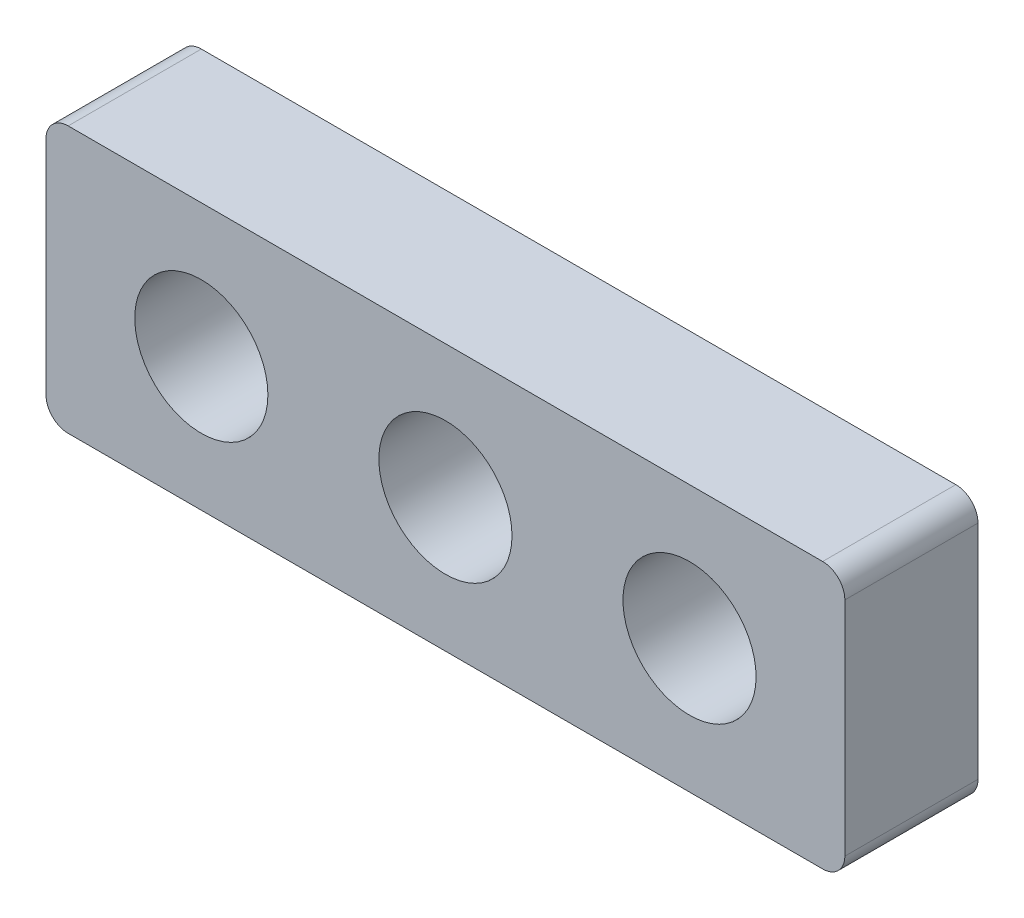
ISO-10303-21;
HEADER;
FILE_DESCRIPTION(('STEP AP214'),'2;1');
FILE_NAME('part.step','',(''),(''),'','','');
FILE_SCHEMA(('AUTOMOTIVE_DESIGN { 1 0 10303 214 1 1 1 1 }'));
ENDSEC;
DATA;
#1=APPLICATION_CONTEXT('core data for automotive mechanical design processes');
#2=APPLICATION_PROTOCOL_DEFINITION('international standard','automotive_design',2000,#1);
#3=PRODUCT_CONTEXT('',#1,'mechanical');
#4=PRODUCT('Part','Part','',(#3));
#5=PRODUCT_RELATED_PRODUCT_CATEGORY('part','',(#4));
#6=PRODUCT_DEFINITION_FORMATION('','',#4);
#7=PRODUCT_DEFINITION_CONTEXT('part definition',#1,'design');
#8=PRODUCT_DEFINITION('design','',#6,#7);
#9=PRODUCT_DEFINITION_SHAPE('','',#8);
#10=(LENGTH_UNIT() NAMED_UNIT(*) SI_UNIT(.MILLI.,.METRE.));
#11=(NAMED_UNIT(*) PLANE_ANGLE_UNIT() SI_UNIT($,.RADIAN.));
#12=(NAMED_UNIT(*) SI_UNIT($,.STERADIAN.) SOLID_ANGLE_UNIT());
#13=UNCERTAINTY_MEASURE_WITH_UNIT(LENGTH_MEASURE(1.E-05),#10,'distance_accuracy_value','');
#14=(GEOMETRIC_REPRESENTATION_CONTEXT(3) GLOBAL_UNCERTAINTY_ASSIGNED_CONTEXT((#13)) GLOBAL_UNIT_ASSIGNED_CONTEXT((#10,
#11,#12)) REPRESENTATION_CONTEXT('',''));
#15=CARTESIAN_POINT('',(0.,0.,0.));
#16=DIRECTION('',(0.,0.,1.));
#17=DIRECTION('',(1.,0.,0.));
#18=AXIS2_PLACEMENT_3D('',#15,#16,#17);
#19=CARTESIAN_POINT('',(0.,0.,1.5));
#20=DIRECTION('',(0.,0.,1.));
#21=DIRECTION('',(1.,0.,0.));
#22=AXIS2_PLACEMENT_3D('',#19,#20,#21);
#23=PLANE('',#22);
#24=CARTESIAN_POINT('',(5.5,0.,1.5));
#25=DIRECTION('',(0.,0.,1.));
#26=DIRECTION('',(1.,0.,0.));
#27=AXIS2_PLACEMENT_3D('',#24,#25,#26);
#28=CIRCLE('',#27,1.5);
#29=CARTESIAN_POINT('',(7.,0.,1.5));
#30=VERTEX_POINT('',#29);
#31=EDGE_CURVE('E192',#30,#30,#28,.T.);
#32=ORIENTED_EDGE('',*,*,#31,.F.);
#33=EDGE_LOOP('',(#32));
#34=FACE_BOUND('',#33,.T.);
#35=CARTESIAN_POINT('',(-5.5,0.,1.5));
#36=DIRECTION('',(0.,0.,1.));
#37=DIRECTION('',(1.,0.,0.));
#38=AXIS2_PLACEMENT_3D('',#35,#36,#37);
#39=CIRCLE('',#38,1.5);
#40=CARTESIAN_POINT('',(-4.,0.,1.5));
#41=VERTEX_POINT('',#40);
#42=EDGE_CURVE('E186',#41,#41,#39,.T.);
#43=ORIENTED_EDGE('',*,*,#42,.F.);
#44=EDGE_LOOP('',(#43));
#45=FACE_BOUND('',#44,.T.);
#46=DIRECTION('',(0.,1.,0.));
#47=VECTOR('',#46,1.);
#48=CARTESIAN_POINT('',(9.,-3.,1.5));
#49=LINE('',#48,#47);
#50=CARTESIAN_POINT('',(9.,-2.5,1.5));
#51=VERTEX_POINT('',#50);
#52=CARTESIAN_POINT('',(9.,2.5,1.5));
#53=VERTEX_POINT('',#52);
#54=EDGE_CURVE('E179',#51,#53,#49,.T.);
#55=ORIENTED_EDGE('',*,*,#54,.T.);
#56=CARTESIAN_POINT('',(8.5,2.5,1.5));
#57=DIRECTION('',(0.,0.,1.));
#58=DIRECTION('',(1.,0.,0.));
#59=AXIS2_PLACEMENT_3D('',#56,#57,#58);
#60=CIRCLE('',#59,0.5);
#61=CARTESIAN_POINT('',(8.5,3.,1.5));
#62=VERTEX_POINT('',#61);
#63=EDGE_CURVE('E156',#53,#62,#60,.T.);
#64=ORIENTED_EDGE('',*,*,#63,.T.);
#65=DIRECTION('',(-1.,0.,0.));
#66=VECTOR('',#65,1.);
#67=CARTESIAN_POINT('',(9.,3.,1.5));
#68=LINE('',#67,#66);
#69=CARTESIAN_POINT('',(-8.5,3.,1.5));
#70=VERTEX_POINT('',#69);
#71=EDGE_CURVE('E124',#62,#70,#68,.T.);
#72=ORIENTED_EDGE('',*,*,#71,.T.);
#73=CARTESIAN_POINT('',(-8.5,2.5,1.5));
#74=DIRECTION('',(0.,0.,1.));
#75=DIRECTION('',(1.,0.,0.));
#76=AXIS2_PLACEMENT_3D('',#73,#74,#75);
#77=CIRCLE('',#76,0.5);
#78=CARTESIAN_POINT('',(-9.,2.5,1.5));
#79=VERTEX_POINT('',#78);
#80=EDGE_CURVE('E151',#70,#79,#77,.T.);
#81=ORIENTED_EDGE('',*,*,#80,.T.);
#82=DIRECTION('',(0.,-1.,0.));
#83=VECTOR('',#82,1.);
#84=CARTESIAN_POINT('',(-9.,-3.,1.5));
#85=LINE('',#84,#83);
#86=CARTESIAN_POINT('',(-9.,-2.5,1.5));
#87=VERTEX_POINT('',#86);
#88=EDGE_CURVE('E132',#79,#87,#85,.T.);
#89=ORIENTED_EDGE('',*,*,#88,.T.);
#90=CARTESIAN_POINT('',(-8.5,-2.5,1.5));
#91=DIRECTION('',(0.,0.,1.));
#92=DIRECTION('',(1.,0.,0.));
#93=AXIS2_PLACEMENT_3D('',#90,#91,#92);
#94=CIRCLE('',#93,0.5);
#95=CARTESIAN_POINT('',(-8.5,-3.,1.5));
#96=VERTEX_POINT('',#95);
#97=EDGE_CURVE('E60',#87,#96,#94,.T.);
#98=ORIENTED_EDGE('',*,*,#97,.T.);
#99=DIRECTION('',(1.,0.,0.));
#100=VECTOR('',#99,1.);
#101=CARTESIAN_POINT('',(9.,-3.,1.5));
#102=LINE('',#101,#100);
#103=CARTESIAN_POINT('',(8.5,-3.,1.5));
#104=VERTEX_POINT('',#103);
#105=EDGE_CURVE('E137',#96,#104,#102,.T.);
#106=ORIENTED_EDGE('',*,*,#105,.T.);
#107=CARTESIAN_POINT('',(8.5,-2.5,1.5));
#108=DIRECTION('',(0.,0.,1.));
#109=DIRECTION('',(1.,0.,0.));
#110=AXIS2_PLACEMENT_3D('',#107,#108,#109);
#111=CIRCLE('',#110,0.5);
#112=EDGE_CURVE('E154',#104,#51,#111,.T.);
#113=ORIENTED_EDGE('',*,*,#112,.T.);
#114=EDGE_LOOP('',(#55,#64,#72,#81,#89,#98,#106,#113));
#115=FACE_BOUND('',#114,.T.);
#116=CARTESIAN_POINT('',(0.,0.,1.5));
#117=DIRECTION('',(0.,0.,1.));
#118=DIRECTION('',(1.,0.,0.));
#119=AXIS2_PLACEMENT_3D('',#116,#117,#118);
#120=CIRCLE('',#119,1.5);
#121=CARTESIAN_POINT('',(1.5,0.,1.5));
#122=VERTEX_POINT('',#121);
#123=EDGE_CURVE('E172',#122,#122,#120,.T.);
#124=ORIENTED_EDGE('',*,*,#123,.F.);
#125=EDGE_LOOP('',(#124));
#126=FACE_BOUND('',#125,.T.);
#127=ADVANCED_FACE('F38',(#34,#45,#115,#126),#23,.T.);
#128=CARTESIAN_POINT('',(0.,0.,-1.5));
#129=DIRECTION('',(0.,0.,1.));
#130=DIRECTION('',(1.,0.,0.));
#131=AXIS2_PLACEMENT_3D('',#128,#129,#130);
#132=PLANE('',#131);
#133=CARTESIAN_POINT('',(5.5,0.,-1.5));
#134=DIRECTION('',(0.,0.,1.));
#135=DIRECTION('',(1.,0.,0.));
#136=AXIS2_PLACEMENT_3D('',#133,#134,#135);
#137=CIRCLE('',#136,1.5);
#138=CARTESIAN_POINT('',(7.,0.,-1.5));
#139=VERTEX_POINT('',#138);
#140=EDGE_CURVE('E189',#139,#139,#137,.T.);
#141=ORIENTED_EDGE('',*,*,#140,.T.);
#142=EDGE_LOOP('',(#141));
#143=FACE_BOUND('',#142,.T.);
#144=CARTESIAN_POINT('',(-5.5,0.,-1.5));
#145=DIRECTION('',(0.,0.,1.));
#146=DIRECTION('',(1.,0.,0.));
#147=AXIS2_PLACEMENT_3D('',#144,#145,#146);
#148=CIRCLE('',#147,1.5);
#149=CARTESIAN_POINT('',(-4.,0.,-1.5));
#150=VERTEX_POINT('',#149);
#151=EDGE_CURVE('E184',#150,#150,#148,.T.);
#152=ORIENTED_EDGE('',*,*,#151,.T.);
#153=EDGE_LOOP('',(#152));
#154=FACE_BOUND('',#153,.T.);
#155=DIRECTION('',(-1.,0.,0.));
#156=VECTOR('',#155,1.);
#157=CARTESIAN_POINT('',(9.,3.,-1.5));
#158=LINE('',#157,#156);
#159=CARTESIAN_POINT('',(8.5,3.,-1.5));
#160=VERTEX_POINT('',#159);
#161=CARTESIAN_POINT('',(-8.5,3.,-1.5));
#162=VERTEX_POINT('',#161);
#163=EDGE_CURVE('E121',#160,#162,#158,.T.);
#164=ORIENTED_EDGE('',*,*,#163,.F.);
#165=CARTESIAN_POINT('',(8.5,2.5,-1.5));
#166=DIRECTION('',(0.,0.,1.));
#167=DIRECTION('',(1.,0.,0.));
#168=AXIS2_PLACEMENT_3D('',#165,#166,#167);
#169=CIRCLE('',#168,0.5);
#170=CARTESIAN_POINT('',(9.,2.5,-1.5));
#171=VERTEX_POINT('',#170);
#172=EDGE_CURVE('E104',#160,#171,#169,.F.);
#173=ORIENTED_EDGE('',*,*,#172,.T.);
#174=DIRECTION('',(0.,1.,0.));
#175=VECTOR('',#174,1.);
#176=CARTESIAN_POINT('',(9.,-3.,-1.5));
#177=LINE('',#176,#175);
#178=CARTESIAN_POINT('',(9.,-2.5,-1.5));
#179=VERTEX_POINT('',#178);
#180=EDGE_CURVE('E133',#179,#171,#177,.T.);
#181=ORIENTED_EDGE('',*,*,#180,.F.);
#182=CARTESIAN_POINT('',(8.5,-2.5,-1.5));
#183=DIRECTION('',(0.,0.,1.));
#184=DIRECTION('',(1.,0.,0.));
#185=AXIS2_PLACEMENT_3D('',#182,#183,#184);
#186=CIRCLE('',#185,0.5);
#187=CARTESIAN_POINT('',(8.5,-3.,-1.5));
#188=VERTEX_POINT('',#187);
#189=EDGE_CURVE('E115',#179,#188,#186,.F.);
#190=ORIENTED_EDGE('',*,*,#189,.T.);
#191=DIRECTION('',(1.,0.,0.));
#192=VECTOR('',#191,1.);
#193=CARTESIAN_POINT('',(9.,-3.,-1.5));
#194=LINE('',#193,#192);
#195=CARTESIAN_POINT('',(-8.5,-3.,-1.5));
#196=VERTEX_POINT('',#195);
#197=EDGE_CURVE('E139',#196,#188,#194,.T.);
#198=ORIENTED_EDGE('',*,*,#197,.F.);
#199=CARTESIAN_POINT('',(-8.5,-2.5,-1.5));
#200=DIRECTION('',(0.,0.,1.));
#201=DIRECTION('',(1.,0.,0.));
#202=AXIS2_PLACEMENT_3D('',#199,#200,#201);
#203=CIRCLE('',#202,0.5);
#204=CARTESIAN_POINT('',(-9.,-2.5,-1.5));
#205=VERTEX_POINT('',#204);
#206=EDGE_CURVE('E145',#196,#205,#203,.F.);
#207=ORIENTED_EDGE('',*,*,#206,.T.);
#208=DIRECTION('',(0.,-1.,0.));
#209=VECTOR('',#208,1.);
#210=CARTESIAN_POINT('',(-9.,-3.,-1.5));
#211=LINE('',#210,#209);
#212=CARTESIAN_POINT('',(-9.,2.5,-1.5));
#213=VERTEX_POINT('',#212);
#214=EDGE_CURVE('E167',#213,#205,#211,.T.);
#215=ORIENTED_EDGE('',*,*,#214,.F.);
#216=CARTESIAN_POINT('',(-8.5,2.5,-1.5));
#217=DIRECTION('',(0.,0.,1.));
#218=DIRECTION('',(1.,0.,0.));
#219=AXIS2_PLACEMENT_3D('',#216,#217,#218);
#220=CIRCLE('',#219,0.5);
#221=EDGE_CURVE('E125',#213,#162,#220,.F.);
#222=ORIENTED_EDGE('',*,*,#221,.T.);
#223=EDGE_LOOP('',(#164,#173,#181,#190,#198,#207,#215,#222));
#224=FACE_BOUND('',#223,.T.);
#225=CARTESIAN_POINT('',(0.,0.,-1.5));
#226=DIRECTION('',(0.,0.,1.));
#227=DIRECTION('',(1.,0.,0.));
#228=AXIS2_PLACEMENT_3D('',#225,#226,#227);
#229=CIRCLE('',#228,1.5);
#230=CARTESIAN_POINT('',(1.5,0.,-1.5));
#231=VERTEX_POINT('',#230);
#232=EDGE_CURVE('E175',#231,#231,#229,.T.);
#233=ORIENTED_EDGE('',*,*,#232,.T.);
#234=EDGE_LOOP('',(#233));
#235=FACE_BOUND('',#234,.T.);
#236=ADVANCED_FACE('F128',(#143,#154,#224,#235),#132,.F.);
#237=CARTESIAN_POINT('',(-9.,-3.,1.5));
#238=DIRECTION('',(1.,0.,0.));
#239=DIRECTION('',(0.,0.,-1.));
#240=AXIS2_PLACEMENT_3D('',#237,#238,#239);
#241=PLANE('',#240);
#242=ORIENTED_EDGE('',*,*,#214,.T.);
#243=DIRECTION('',(0.,0.,-1.));
#244=VECTOR('',#243,1.);
#245=CARTESIAN_POINT('',(-9.,-2.5,1.5));
#246=LINE('',#245,#244);
#247=EDGE_CURVE('E11',#205,#87,#246,.F.);
#248=ORIENTED_EDGE('',*,*,#247,.T.);
#249=ORIENTED_EDGE('',*,*,#88,.F.);
#250=DIRECTION('',(0.,0.,-1.));
#251=VECTOR('',#250,1.);
#252=CARTESIAN_POINT('',(-9.,2.5,1.5));
#253=LINE('',#252,#251);
#254=EDGE_CURVE('E46',#79,#213,#253,.T.);
#255=ORIENTED_EDGE('',*,*,#254,.T.);
#256=EDGE_LOOP('',(#242,#248,#249,#255));
#257=FACE_BOUND('',#256,.T.);
#258=ADVANCED_FACE('F166',(#257),#241,.F.);
#259=CARTESIAN_POINT('',(9.,-3.,1.5));
#260=DIRECTION('',(0.,1.,0.));
#261=DIRECTION('',(-1.,0.,0.));
#262=AXIS2_PLACEMENT_3D('',#259,#260,#261);
#263=PLANE('',#262);
#264=ORIENTED_EDGE('',*,*,#197,.T.);
#265=DIRECTION('',(0.,0.,-1.));
#266=VECTOR('',#265,1.);
#267=CARTESIAN_POINT('',(8.5,-3.,1.5));
#268=LINE('',#267,#266);
#269=EDGE_CURVE('E53',#188,#104,#268,.F.);
#270=ORIENTED_EDGE('',*,*,#269,.T.);
#271=ORIENTED_EDGE('',*,*,#105,.F.);
#272=DIRECTION('',(0.,0.,-1.));
#273=VECTOR('',#272,1.);
#274=CARTESIAN_POINT('',(-8.5,-3.,1.5));
#275=LINE('',#274,#273);
#276=EDGE_CURVE('E158',#96,#196,#275,.T.);
#277=ORIENTED_EDGE('',*,*,#276,.T.);
#278=EDGE_LOOP('',(#264,#270,#271,#277));
#279=FACE_BOUND('',#278,.T.);
#280=ADVANCED_FACE('F225',(#279),#263,.F.);
#281=CARTESIAN_POINT('',(9.,-3.,1.5));
#282=DIRECTION('',(-1.,0.,0.));
#283=DIRECTION('',(0.,0.,1.));
#284=AXIS2_PLACEMENT_3D('',#281,#282,#283);
#285=PLANE('',#284);
#286=ORIENTED_EDGE('',*,*,#180,.T.);
#287=DIRECTION('',(0.,0.,-1.));
#288=VECTOR('',#287,1.);
#289=CARTESIAN_POINT('',(9.,2.5,1.5));
#290=LINE('',#289,#288);
#291=EDGE_CURVE('E109',#171,#53,#290,.F.);
#292=ORIENTED_EDGE('',*,*,#291,.T.);
#293=ORIENTED_EDGE('',*,*,#54,.F.);
#294=DIRECTION('',(0.,0.,-1.));
#295=VECTOR('',#294,1.);
#296=CARTESIAN_POINT('',(9.,-2.5,1.5));
#297=LINE('',#296,#295);
#298=EDGE_CURVE('E114',#51,#179,#297,.T.);
#299=ORIENTED_EDGE('',*,*,#298,.T.);
#300=EDGE_LOOP('',(#286,#292,#293,#299));
#301=FACE_BOUND('',#300,.T.);
#302=ADVANCED_FACE('F230',(#301),#285,.F.);
#303=CARTESIAN_POINT('',(9.,3.,1.5));
#304=DIRECTION('',(0.,-1.,0.));
#305=DIRECTION('',(1.,0.,0.));
#306=AXIS2_PLACEMENT_3D('',#303,#304,#305);
#307=PLANE('',#306);
#308=ORIENTED_EDGE('',*,*,#71,.F.);
#309=DIRECTION('',(0.,0.,-1.));
#310=VECTOR('',#309,1.);
#311=CARTESIAN_POINT('',(8.5,3.,1.5));
#312=LINE('',#311,#310);
#313=EDGE_CURVE('E108',#62,#160,#312,.T.);
#314=ORIENTED_EDGE('',*,*,#313,.T.);
#315=ORIENTED_EDGE('',*,*,#163,.T.);
#316=DIRECTION('',(0.,0.,-1.));
#317=VECTOR('',#316,1.);
#318=CARTESIAN_POINT('',(-8.5,3.,1.5));
#319=LINE('',#318,#317);
#320=EDGE_CURVE('E126',#162,#70,#319,.F.);
#321=ORIENTED_EDGE('',*,*,#320,.T.);
#322=EDGE_LOOP('',(#308,#314,#315,#321));
#323=FACE_BOUND('',#322,.T.);
#324=ADVANCED_FACE('F120',(#323),#307,.F.);
#325=CARTESIAN_POINT('',(0.,0.,1.5));
#326=DIRECTION('',(0.,0.,-1.));
#327=DIRECTION('',(-1.,0.,0.));
#328=AXIS2_PLACEMENT_3D('',#325,#326,#327);
#329=CYLINDRICAL_SURFACE('',#328,1.5);
#330=ORIENTED_EDGE('',*,*,#123,.T.);
#331=EDGE_LOOP('',(#330));
#332=FACE_BOUND('',#331,.T.);
#333=ORIENTED_EDGE('',*,*,#232,.F.);
#334=EDGE_LOOP('',(#333));
#335=FACE_BOUND('',#334,.T.);
#336=ADVANCED_FACE('F215',(#332,#335),#329,.F.);
#337=CARTESIAN_POINT('',(-5.5,0.,-1.5));
#338=DIRECTION('',(0.,0.,1.));
#339=DIRECTION('',(1.,0.,0.));
#340=AXIS2_PLACEMENT_3D('',#337,#338,#339);
#341=CYLINDRICAL_SURFACE('',#340,1.5);
#342=ORIENTED_EDGE('',*,*,#151,.F.);
#343=EDGE_LOOP('',(#342));
#344=FACE_BOUND('',#343,.T.);
#345=ORIENTED_EDGE('',*,*,#42,.T.);
#346=EDGE_LOOP('',(#345));
#347=FACE_BOUND('',#346,.T.);
#348=ADVANCED_FACE('F203',(#344,#347),#341,.F.);
#349=CARTESIAN_POINT('',(5.5,0.,-1.5));
#350=DIRECTION('',(0.,0.,1.));
#351=DIRECTION('',(1.,0.,0.));
#352=AXIS2_PLACEMENT_3D('',#349,#350,#351);
#353=CYLINDRICAL_SURFACE('',#352,1.5);
#354=ORIENTED_EDGE('',*,*,#140,.F.);
#355=EDGE_LOOP('',(#354));
#356=FACE_BOUND('',#355,.T.);
#357=ORIENTED_EDGE('',*,*,#31,.T.);
#358=EDGE_LOOP('',(#357));
#359=FACE_BOUND('',#358,.T.);
#360=ADVANCED_FACE('F200',(#356,#359),#353,.F.);
#361=CARTESIAN_POINT('',(8.5,2.5,1.5));
#362=DIRECTION('',(0.,0.,-1.));
#363=DIRECTION('',(-1.,0.,0.));
#364=AXIS2_PLACEMENT_3D('',#361,#362,#363);
#365=CYLINDRICAL_SURFACE('',#364,0.5);
#366=ORIENTED_EDGE('',*,*,#63,.F.);
#367=ORIENTED_EDGE('',*,*,#291,.F.);
#368=ORIENTED_EDGE('',*,*,#172,.F.);
#369=ORIENTED_EDGE('',*,*,#313,.F.);
#370=EDGE_LOOP('',(#366,#367,#368,#369));
#371=FACE_BOUND('',#370,.T.);
#372=ADVANCED_FACE('F107',(#371),#365,.T.);
#373=CARTESIAN_POINT('',(8.5,-2.5,1.5));
#374=DIRECTION('',(0.,0.,-1.));
#375=DIRECTION('',(-1.,0.,0.));
#376=AXIS2_PLACEMENT_3D('',#373,#374,#375);
#377=CYLINDRICAL_SURFACE('',#376,0.5);
#378=ORIENTED_EDGE('',*,*,#112,.F.);
#379=ORIENTED_EDGE('',*,*,#269,.F.);
#380=ORIENTED_EDGE('',*,*,#189,.F.);
#381=ORIENTED_EDGE('',*,*,#298,.F.);
#382=EDGE_LOOP('',(#378,#379,#380,#381));
#383=FACE_BOUND('',#382,.T.);
#384=ADVANCED_FACE('F238',(#383),#377,.T.);
#385=CARTESIAN_POINT('',(-8.5,-2.5,1.5));
#386=DIRECTION('',(0.,0.,-1.));
#387=DIRECTION('',(-1.,0.,0.));
#388=AXIS2_PLACEMENT_3D('',#385,#386,#387);
#389=CYLINDRICAL_SURFACE('',#388,0.5);
#390=ORIENTED_EDGE('',*,*,#97,.F.);
#391=ORIENTED_EDGE('',*,*,#247,.F.);
#392=ORIENTED_EDGE('',*,*,#206,.F.);
#393=ORIENTED_EDGE('',*,*,#276,.F.);
#394=EDGE_LOOP('',(#390,#391,#392,#393));
#395=FACE_BOUND('',#394,.T.);
#396=ADVANCED_FACE('F240',(#395),#389,.T.);
#397=CARTESIAN_POINT('',(-8.5,2.5,1.5));
#398=DIRECTION('',(0.,0.,-1.));
#399=DIRECTION('',(-1.,0.,0.));
#400=AXIS2_PLACEMENT_3D('',#397,#398,#399);
#401=CYLINDRICAL_SURFACE('',#400,0.5);
#402=ORIENTED_EDGE('',*,*,#80,.F.);
#403=ORIENTED_EDGE('',*,*,#320,.F.);
#404=ORIENTED_EDGE('',*,*,#221,.F.);
#405=ORIENTED_EDGE('',*,*,#254,.F.);
#406=EDGE_LOOP('',(#402,#403,#404,#405));
#407=FACE_BOUND('',#406,.T.);
#408=ADVANCED_FACE('F40',(#407),#401,.T.);
#409=CLOSED_SHELL('',(#127,#236,#258,#280,#302,#324,#336,#348,#360,#372,#384,#396,#408));
#410=MANIFOLD_SOLID_BREP('B2',#409);
#411=ADVANCED_BREP_SHAPE_REPRESENTATION('',(#18,#410),#14);
#412=SHAPE_DEFINITION_REPRESENTATION(#9,#411);
ENDSEC;
END-ISO-10303-21;
